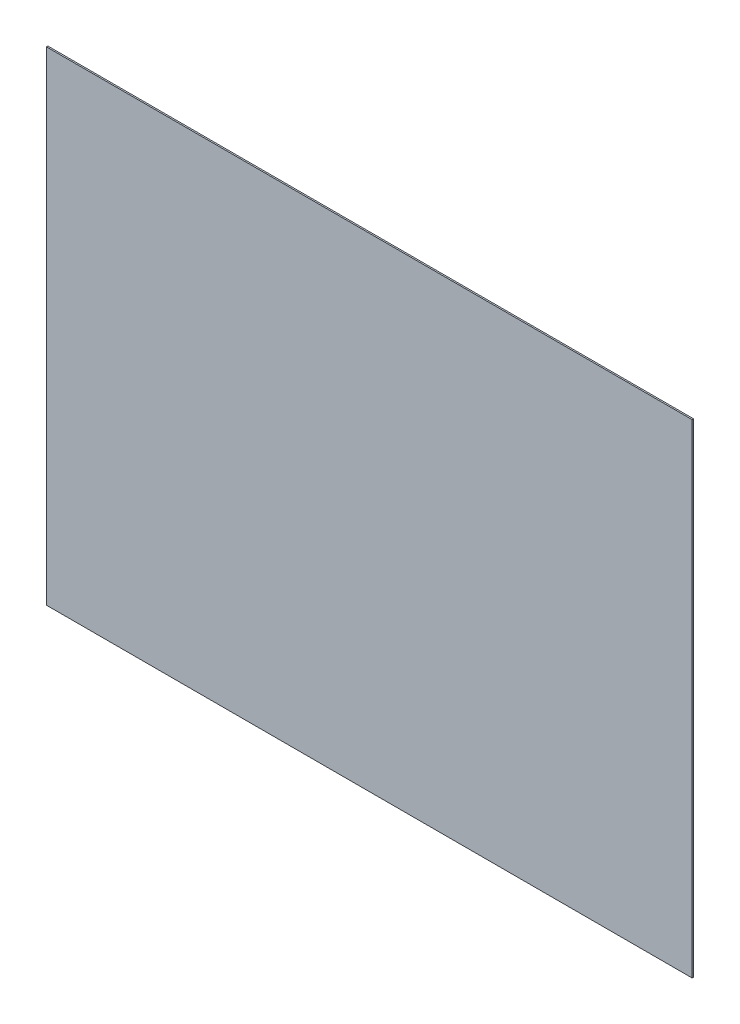
ISO-10303-21;
HEADER;
FILE_DESCRIPTION(('STEP AP214'),'2;1');
FILE_NAME('part.step','',(''),(''),'','','');
FILE_SCHEMA(('AUTOMOTIVE_DESIGN { 1 0 10303 214 1 1 1 1 }'));
ENDSEC;
DATA;
#1=APPLICATION_CONTEXT('core data for automotive mechanical design processes');
#2=APPLICATION_PROTOCOL_DEFINITION('international standard','automotive_design',2000,#1);
#3=PRODUCT_CONTEXT('',#1,'mechanical');
#4=PRODUCT('Part','Part','',(#3));
#5=PRODUCT_RELATED_PRODUCT_CATEGORY('part','',(#4));
#6=PRODUCT_DEFINITION_FORMATION('','',#4);
#7=PRODUCT_DEFINITION_CONTEXT('part definition',#1,'design');
#8=PRODUCT_DEFINITION('design','',#6,#7);
#9=PRODUCT_DEFINITION_SHAPE('','',#8);
#10=(LENGTH_UNIT() NAMED_UNIT(*) SI_UNIT(.MILLI.,.METRE.));
#11=(NAMED_UNIT(*) PLANE_ANGLE_UNIT() SI_UNIT($,.RADIAN.));
#12=(NAMED_UNIT(*) SI_UNIT($,.STERADIAN.) SOLID_ANGLE_UNIT());
#13=UNCERTAINTY_MEASURE_WITH_UNIT(LENGTH_MEASURE(1.E-05),#10,'distance_accuracy_value','');
#14=(GEOMETRIC_REPRESENTATION_CONTEXT(3) GLOBAL_UNCERTAINTY_ASSIGNED_CONTEXT((#13)) GLOBAL_UNIT_ASSIGNED_CONTEXT((#10,
#11,#12)) REPRESENTATION_CONTEXT('',''));
#15=CARTESIAN_POINT('',(0.,0.,0.));
#16=DIRECTION('',(0.,0.,1.));
#17=DIRECTION('',(1.,0.,0.));
#18=AXIS2_PLACEMENT_3D('',#15,#16,#17);
#19=CARTESIAN_POINT('',(225.,168.5,1.));
#20=DIRECTION('',(-1.,0.,0.));
#21=DIRECTION('',(0.,-1.,0.));
#22=AXIS2_PLACEMENT_3D('',#19,#20,#21);
#23=PLANE('',#22);
#24=DIRECTION('',(0.,1.,0.));
#25=VECTOR('',#24,1.);
#26=CARTESIAN_POINT('',(225.,168.5,0.));
#27=LINE('',#26,#25);
#28=CARTESIAN_POINT('',(225.,-168.5,0.));
#29=VERTEX_POINT('',#28);
#30=CARTESIAN_POINT('',(225.,168.5,0.));
#31=VERTEX_POINT('',#30);
#32=EDGE_CURVE('E113',#29,#31,#27,.T.);
#33=ORIENTED_EDGE('',*,*,#32,.T.);
#34=DIRECTION('',(0.,0.,-1.));
#35=VECTOR('',#34,1.);
#36=CARTESIAN_POINT('',(225.,168.5,1.));
#37=LINE('',#36,#35);
#38=CARTESIAN_POINT('',(225.,168.5,1.));
#39=VERTEX_POINT('',#38);
#40=EDGE_CURVE('E11',#39,#31,#37,.T.);
#41=ORIENTED_EDGE('',*,*,#40,.F.);
#42=DIRECTION('',(0.,1.,0.));
#43=VECTOR('',#42,1.);
#44=CARTESIAN_POINT('',(225.,168.5,1.));
#45=LINE('',#44,#43);
#46=CARTESIAN_POINT('',(225.,-168.5,1.));
#47=VERTEX_POINT('',#46);
#48=EDGE_CURVE('E97',#47,#39,#45,.T.);
#49=ORIENTED_EDGE('',*,*,#48,.F.);
#50=DIRECTION('',(0.,0.,-1.));
#51=VECTOR('',#50,1.);
#52=CARTESIAN_POINT('',(225.,-168.5,1.));
#53=LINE('',#52,#51);
#54=EDGE_CURVE('E109',#47,#29,#53,.T.);
#55=ORIENTED_EDGE('',*,*,#54,.T.);
#56=EDGE_LOOP('',(#33,#41,#49,#55));
#57=FACE_BOUND('',#56,.T.);
#58=ADVANCED_FACE('F45',(#57),#23,.F.);
#59=CARTESIAN_POINT('',(-225.,168.5,1.));
#60=DIRECTION('',(0.,-1.,0.));
#61=DIRECTION('',(0.,0.,-1.));
#62=AXIS2_PLACEMENT_3D('',#59,#60,#61);
#63=PLANE('',#62);
#64=DIRECTION('',(-1.,0.,0.));
#65=VECTOR('',#64,1.);
#66=CARTESIAN_POINT('',(-225.,168.5,0.));
#67=LINE('',#66,#65);
#68=CARTESIAN_POINT('',(-225.,168.5,0.));
#69=VERTEX_POINT('',#68);
#70=EDGE_CURVE('E102',#31,#69,#67,.T.);
#71=ORIENTED_EDGE('',*,*,#70,.T.);
#72=DIRECTION('',(0.,0.,-1.));
#73=VECTOR('',#72,1.);
#74=CARTESIAN_POINT('',(-225.,168.5,1.));
#75=LINE('',#74,#73);
#76=CARTESIAN_POINT('',(-225.,168.5,1.));
#77=VERTEX_POINT('',#76);
#78=EDGE_CURVE('E54',#77,#69,#75,.T.);
#79=ORIENTED_EDGE('',*,*,#78,.F.);
#80=DIRECTION('',(-1.,0.,0.));
#81=VECTOR('',#80,1.);
#82=CARTESIAN_POINT('',(-225.,168.5,1.));
#83=LINE('',#82,#81);
#84=EDGE_CURVE('E92',#39,#77,#83,.T.);
#85=ORIENTED_EDGE('',*,*,#84,.F.);
#86=ORIENTED_EDGE('',*,*,#40,.T.);
#87=EDGE_LOOP('',(#71,#79,#85,#86));
#88=FACE_BOUND('',#87,.T.);
#89=ADVANCED_FACE('F101',(#88),#63,.F.);
#90=CARTESIAN_POINT('',(-225.,168.5,1.));
#91=DIRECTION('',(1.,0.,0.));
#92=DIRECTION('',(0.,1.,0.));
#93=AXIS2_PLACEMENT_3D('',#90,#91,#92);
#94=PLANE('',#93);
#95=DIRECTION('',(0.,-1.,0.));
#96=VECTOR('',#95,1.);
#97=CARTESIAN_POINT('',(-225.,168.5,0.));
#98=LINE('',#97,#96);
#99=CARTESIAN_POINT('',(-225.,-168.5,0.));
#100=VERTEX_POINT('',#99);
#101=EDGE_CURVE('E79',#69,#100,#98,.T.);
#102=ORIENTED_EDGE('',*,*,#101,.T.);
#103=DIRECTION('',(0.,0.,-1.));
#104=VECTOR('',#103,1.);
#105=CARTESIAN_POINT('',(-225.,-168.5,1.));
#106=LINE('',#105,#104);
#107=CARTESIAN_POINT('',(-225.,-168.5,1.));
#108=VERTEX_POINT('',#107);
#109=EDGE_CURVE('E104',#108,#100,#106,.T.);
#110=ORIENTED_EDGE('',*,*,#109,.F.);
#111=DIRECTION('',(0.,-1.,0.));
#112=VECTOR('',#111,1.);
#113=CARTESIAN_POINT('',(-225.,168.5,1.));
#114=LINE('',#113,#112);
#115=EDGE_CURVE('E95',#77,#108,#114,.T.);
#116=ORIENTED_EDGE('',*,*,#115,.F.);
#117=ORIENTED_EDGE('',*,*,#78,.T.);
#118=EDGE_LOOP('',(#102,#110,#116,#117));
#119=FACE_BOUND('',#118,.T.);
#120=ADVANCED_FACE('F105',(#119),#94,.F.);
#121=CARTESIAN_POINT('',(-225.,-168.5,1.));
#122=DIRECTION('',(0.,1.,0.));
#123=DIRECTION('',(0.,0.,1.));
#124=AXIS2_PLACEMENT_3D('',#121,#122,#123);
#125=PLANE('',#124);
#126=DIRECTION('',(1.,0.,0.));
#127=VECTOR('',#126,1.);
#128=CARTESIAN_POINT('',(-225.,-168.5,0.));
#129=LINE('',#128,#127);
#130=EDGE_CURVE('E85',#100,#29,#129,.T.);
#131=ORIENTED_EDGE('',*,*,#130,.T.);
#132=ORIENTED_EDGE('',*,*,#54,.F.);
#133=DIRECTION('',(1.,0.,0.));
#134=VECTOR('',#133,1.);
#135=CARTESIAN_POINT('',(-225.,-168.5,1.));
#136=LINE('',#135,#134);
#137=EDGE_CURVE('E62',#108,#47,#136,.T.);
#138=ORIENTED_EDGE('',*,*,#137,.F.);
#139=ORIENTED_EDGE('',*,*,#109,.T.);
#140=EDGE_LOOP('',(#131,#132,#138,#139));
#141=FACE_BOUND('',#140,.T.);
#142=ADVANCED_FACE('F126',(#141),#125,.F.);
#143=CARTESIAN_POINT('',(0.,0.,1.));
#144=DIRECTION('',(0.,0.,1.));
#145=DIRECTION('',(1.,0.,0.));
#146=AXIS2_PLACEMENT_3D('',#143,#144,#145);
#147=PLANE('',#146);
#148=ORIENTED_EDGE('',*,*,#48,.T.);
#149=ORIENTED_EDGE('',*,*,#84,.T.);
#150=ORIENTED_EDGE('',*,*,#115,.T.);
#151=ORIENTED_EDGE('',*,*,#137,.T.);
#152=EDGE_LOOP('',(#148,#149,#150,#151));
#153=FACE_BOUND('',#152,.T.);
#154=ADVANCED_FACE('F93',(#153),#147,.T.);
#155=CARTESIAN_POINT('',(0.,0.,0.));
#156=DIRECTION('',(0.,0.,1.));
#157=DIRECTION('',(1.,0.,0.));
#158=AXIS2_PLACEMENT_3D('',#155,#156,#157);
#159=PLANE('',#158);
#160=ORIENTED_EDGE('',*,*,#32,.F.);
#161=ORIENTED_EDGE('',*,*,#130,.F.);
#162=ORIENTED_EDGE('',*,*,#101,.F.);
#163=ORIENTED_EDGE('',*,*,#70,.F.);
#164=EDGE_LOOP('',(#160,#161,#162,#163));
#165=FACE_BOUND('',#164,.T.);
#166=ADVANCED_FACE('F129',(#165),#159,.F.);
#167=CLOSED_SHELL('',(#58,#89,#120,#142,#154,#166));
#168=MANIFOLD_SOLID_BREP('B2',#167);
#169=ADVANCED_BREP_SHAPE_REPRESENTATION('',(#18,#168),#14);
#170=SHAPE_DEFINITION_REPRESENTATION(#9,#169);
ENDSEC;
END-ISO-10303-21;
